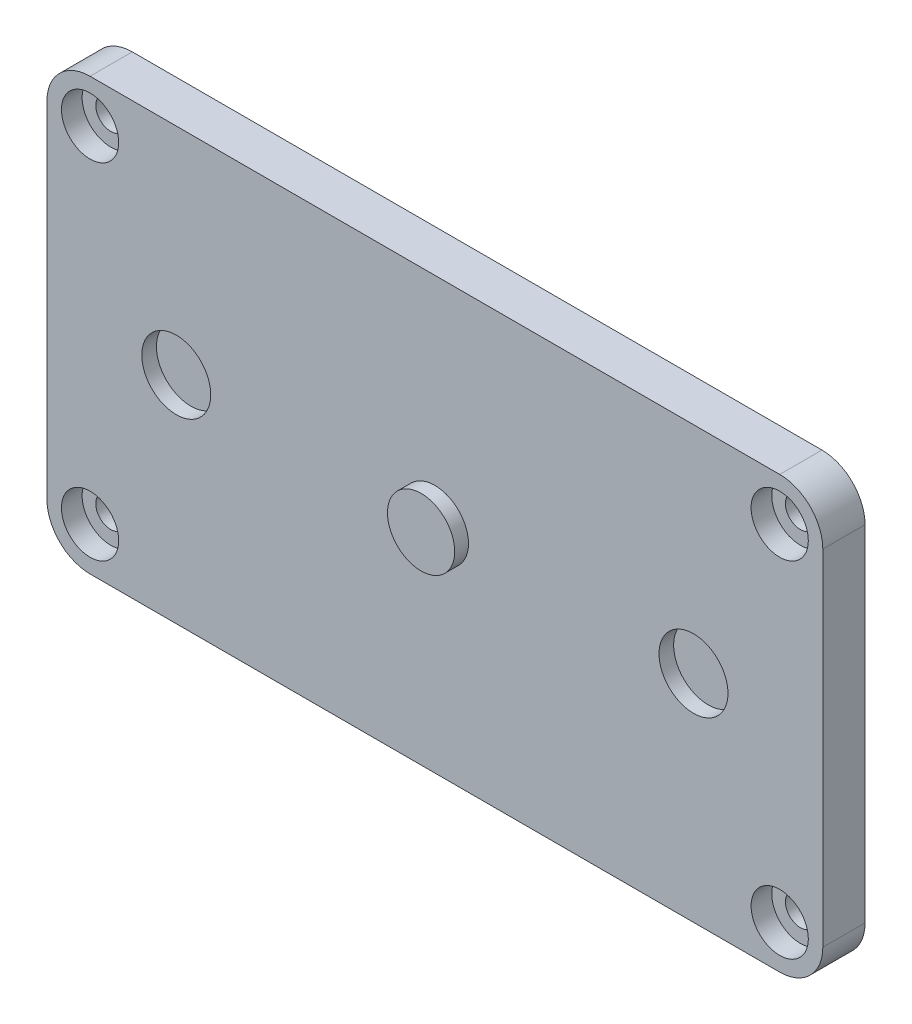
ISO-10303-21;
HEADER;
FILE_DESCRIPTION(('STEP AP214'),'2;1');
FILE_NAME('part.step','',(''),(''),'','','');
FILE_SCHEMA(('AUTOMOTIVE_DESIGN { 1 0 10303 214 1 1 1 1 }'));
ENDSEC;
DATA;
#1=APPLICATION_CONTEXT('core data for automotive mechanical design processes');
#2=APPLICATION_PROTOCOL_DEFINITION('international standard','automotive_design',2000,#1);
#3=PRODUCT_CONTEXT('',#1,'mechanical');
#4=PRODUCT('Part','Part','',(#3));
#5=PRODUCT_RELATED_PRODUCT_CATEGORY('part','',(#4));
#6=PRODUCT_DEFINITION_FORMATION('','',#4);
#7=PRODUCT_DEFINITION_CONTEXT('part definition',#1,'design');
#8=PRODUCT_DEFINITION('design','',#6,#7);
#9=PRODUCT_DEFINITION_SHAPE('','',#8);
#10=(LENGTH_UNIT() NAMED_UNIT(*) SI_UNIT(.MILLI.,.METRE.));
#11=(NAMED_UNIT(*) PLANE_ANGLE_UNIT() SI_UNIT($,.RADIAN.));
#12=(NAMED_UNIT(*) SI_UNIT($,.STERADIAN.) SOLID_ANGLE_UNIT());
#13=UNCERTAINTY_MEASURE_WITH_UNIT(LENGTH_MEASURE(1.E-05),#10,'distance_accuracy_value','');
#14=(GEOMETRIC_REPRESENTATION_CONTEXT(3) GLOBAL_UNCERTAINTY_ASSIGNED_CONTEXT((#13)) GLOBAL_UNIT_ASSIGNED_CONTEXT((#10,
#11,#12)) REPRESENTATION_CONTEXT('',''));
#15=CARTESIAN_POINT('',(0.,0.,0.));
#16=DIRECTION('',(0.,0.,1.));
#17=DIRECTION('',(1.,0.,0.));
#18=AXIS2_PLACEMENT_3D('',#15,#16,#17);
#19=CARTESIAN_POINT('',(-50.8,-25.4,6.223));
#20=DIRECTION('',(0.,0.,-1.));
#21=DIRECTION('',(-1.,0.,0.));
#22=AXIS2_PLACEMENT_3D('',#19,#20,#21);
#23=CYLINDRICAL_SURFACE('',#22,2.2098);
#24=CARTESIAN_POINT('',(-50.8,-25.4,0.));
#25=DIRECTION('',(0.,0.,1.));
#26=DIRECTION('',(1.,0.,0.));
#27=AXIS2_PLACEMENT_3D('',#24,#25,#26);
#28=CIRCLE('',#27,2.2098);
#29=CARTESIAN_POINT('',(-48.5902,-25.4,0.));
#30=VERTEX_POINT('',#29);
#31=EDGE_CURVE('E143',#30,#30,#28,.T.);
#32=ORIENTED_EDGE('',*,*,#31,.F.);
#33=EDGE_LOOP('',(#32));
#34=FACE_BOUND('',#33,.T.);
#35=CARTESIAN_POINT('',(-50.8,-25.4,3.175));
#36=DIRECTION('',(0.,0.,1.));
#37=DIRECTION('',(1.,0.,0.));
#38=AXIS2_PLACEMENT_3D('',#35,#36,#37);
#39=CIRCLE('',#38,2.2098);
#40=CARTESIAN_POINT('',(-48.5902,-25.4,3.175));
#41=VERTEX_POINT('',#40);
#42=EDGE_CURVE('E44',#41,#41,#39,.T.);
#43=ORIENTED_EDGE('',*,*,#42,.T.);
#44=EDGE_LOOP('',(#43));
#45=FACE_BOUND('',#44,.T.);
#46=ADVANCED_FACE('F40',(#34,#45),#23,.F.);
#47=CARTESIAN_POINT('',(-50.8,25.4,6.223));
#48=DIRECTION('',(0.,0.,-1.));
#49=DIRECTION('',(-1.,0.,0.));
#50=AXIS2_PLACEMENT_3D('',#47,#48,#49);
#51=CYLINDRICAL_SURFACE('',#50,2.2098);
#52=CARTESIAN_POINT('',(-50.8,25.4,0.));
#53=DIRECTION('',(0.,0.,1.));
#54=DIRECTION('',(1.,0.,0.));
#55=AXIS2_PLACEMENT_3D('',#52,#53,#54);
#56=CIRCLE('',#55,2.2098);
#57=CARTESIAN_POINT('',(-48.5902,25.4,0.));
#58=VERTEX_POINT('',#57);
#59=EDGE_CURVE('E186',#58,#58,#56,.T.);
#60=ORIENTED_EDGE('',*,*,#59,.F.);
#61=EDGE_LOOP('',(#60));
#62=FACE_BOUND('',#61,.T.);
#63=CARTESIAN_POINT('',(-50.8,25.4,3.175));
#64=DIRECTION('',(0.,0.,1.));
#65=DIRECTION('',(1.,0.,0.));
#66=AXIS2_PLACEMENT_3D('',#63,#64,#65);
#67=CIRCLE('',#66,2.2098);
#68=CARTESIAN_POINT('',(-48.5902,25.4,3.175));
#69=VERTEX_POINT('',#68);
#70=EDGE_CURVE('E172',#69,#69,#67,.T.);
#71=ORIENTED_EDGE('',*,*,#70,.T.);
#72=EDGE_LOOP('',(#71));
#73=FACE_BOUND('',#72,.T.);
#74=ADVANCED_FACE('F233',(#62,#73),#51,.F.);
#75=CARTESIAN_POINT('',(50.8,25.4,6.223));
#76=DIRECTION('',(0.,0.,-1.));
#77=DIRECTION('',(-1.,0.,0.));
#78=AXIS2_PLACEMENT_3D('',#75,#76,#77);
#79=CYLINDRICAL_SURFACE('',#78,2.2098);
#80=CARTESIAN_POINT('',(50.8,25.4,0.));
#81=DIRECTION('',(0.,0.,1.));
#82=DIRECTION('',(1.,0.,0.));
#83=AXIS2_PLACEMENT_3D('',#80,#81,#82);
#84=CIRCLE('',#83,2.2098);
#85=CARTESIAN_POINT('',(53.0098,25.4,0.));
#86=VERTEX_POINT('',#85);
#87=EDGE_CURVE('E181',#86,#86,#84,.T.);
#88=ORIENTED_EDGE('',*,*,#87,.F.);
#89=EDGE_LOOP('',(#88));
#90=FACE_BOUND('',#89,.T.);
#91=CARTESIAN_POINT('',(50.8,25.4,3.175));
#92=DIRECTION('',(0.,0.,1.));
#93=DIRECTION('',(1.,0.,0.));
#94=AXIS2_PLACEMENT_3D('',#91,#92,#93);
#95=CIRCLE('',#94,2.2098);
#96=CARTESIAN_POINT('',(53.0098,25.4,3.175));
#97=VERTEX_POINT('',#96);
#98=EDGE_CURVE('E169',#97,#97,#95,.T.);
#99=ORIENTED_EDGE('',*,*,#98,.T.);
#100=EDGE_LOOP('',(#99));
#101=FACE_BOUND('',#100,.T.);
#102=ADVANCED_FACE('F239',(#90,#101),#79,.F.);
#103=CARTESIAN_POINT('',(50.8,-25.4,6.223));
#104=DIRECTION('',(0.,0.,-1.));
#105=DIRECTION('',(-1.,0.,0.));
#106=AXIS2_PLACEMENT_3D('',#103,#104,#105);
#107=CYLINDRICAL_SURFACE('',#106,2.2098);
#108=CARTESIAN_POINT('',(50.8,-25.4,0.));
#109=DIRECTION('',(0.,0.,1.));
#110=DIRECTION('',(1.,0.,0.));
#111=AXIS2_PLACEMENT_3D('',#108,#109,#110);
#112=CIRCLE('',#111,2.2098);
#113=CARTESIAN_POINT('',(53.0098,-25.4,0.));
#114=VERTEX_POINT('',#113);
#115=EDGE_CURVE('E177',#114,#114,#112,.T.);
#116=ORIENTED_EDGE('',*,*,#115,.F.);
#117=EDGE_LOOP('',(#116));
#118=FACE_BOUND('',#117,.T.);
#119=CARTESIAN_POINT('',(50.8,-25.4,3.175));
#120=DIRECTION('',(0.,0.,1.));
#121=DIRECTION('',(1.,0.,0.));
#122=AXIS2_PLACEMENT_3D('',#119,#120,#121);
#123=CIRCLE('',#122,2.2098);
#124=CARTESIAN_POINT('',(53.0098,-25.4,3.175));
#125=VERTEX_POINT('',#124);
#126=EDGE_CURVE('E166',#125,#125,#123,.T.);
#127=ORIENTED_EDGE('',*,*,#126,.T.);
#128=EDGE_LOOP('',(#127));
#129=FACE_BOUND('',#128,.T.);
#130=ADVANCED_FACE('F246',(#118,#129),#107,.F.);
#131=CARTESIAN_POINT('',(50.8,-25.4,6.223));
#132=DIRECTION('',(0.,0.,1.));
#133=DIRECTION('',(1.,0.,0.));
#134=AXIS2_PLACEMENT_3D('',#131,#132,#133);
#135=PLANE('',#134);
#136=CARTESIAN_POINT('',(0.,0.,6.223));
#137=DIRECTION('',(0.,0.,1.));
#138=DIRECTION('',(1.,0.,0.));
#139=AXIS2_PLACEMENT_3D('',#136,#137,#138);
#140=CIRCLE('',#139,4.953);
#141=CARTESIAN_POINT('',(4.953,0.,6.223));
#142=VERTEX_POINT('',#141);
#143=EDGE_CURVE('E484',#142,#142,#140,.T.);
#144=ORIENTED_EDGE('',*,*,#143,.F.);
#145=EDGE_LOOP('',(#144));
#146=FACE_BOUND('',#145,.T.);
#147=CARTESIAN_POINT('',(38.1,0.,6.223));
#148=DIRECTION('',(0.,0.,1.));
#149=DIRECTION('',(1.,0.,0.));
#150=AXIS2_PLACEMENT_3D('',#147,#148,#149);
#151=CIRCLE('',#150,5.08);
#152=CARTESIAN_POINT('',(43.18,0.,6.223));
#153=VERTEX_POINT('',#152);
#154=EDGE_CURVE('E496',#153,#153,#151,.T.);
#155=ORIENTED_EDGE('',*,*,#154,.F.);
#156=EDGE_LOOP('',(#155));
#157=FACE_BOUND('',#156,.T.);
#158=CARTESIAN_POINT('',(-38.1,0.,6.223));
#159=DIRECTION('',(0.,0.,1.));
#160=DIRECTION('',(1.,0.,0.));
#161=AXIS2_PLACEMENT_3D('',#158,#159,#160);
#162=CIRCLE('',#161,5.08);
#163=CARTESIAN_POINT('',(-33.02,0.,6.223));
#164=VERTEX_POINT('',#163);
#165=EDGE_CURVE('E487',#164,#164,#162,.T.);
#166=ORIENTED_EDGE('',*,*,#165,.F.);
#167=EDGE_LOOP('',(#166));
#168=FACE_BOUND('',#167,.T.);
#169=CARTESIAN_POINT('',(-50.8,-25.4,6.223));
#170=DIRECTION('',(0.,0.,1.));
#171=DIRECTION('',(1.,0.,0.));
#172=AXIS2_PLACEMENT_3D('',#169,#170,#171);
#173=CIRCLE('',#172,4.2164);
#174=CARTESIAN_POINT('',(-46.5836,-25.4,6.223));
#175=VERTEX_POINT('',#174);
#176=EDGE_CURVE('E513',#175,#175,#173,.T.);
#177=ORIENTED_EDGE('',*,*,#176,.F.);
#178=EDGE_LOOP('',(#177));
#179=FACE_BOUND('',#178,.T.);
#180=CARTESIAN_POINT('',(50.8,-25.4,6.223));
#181=DIRECTION('',(0.,0.,1.));
#182=DIRECTION('',(1.,0.,0.));
#183=AXIS2_PLACEMENT_3D('',#180,#181,#182);
#184=CIRCLE('',#183,4.2164);
#185=CARTESIAN_POINT('',(55.0164,-25.4,6.223));
#186=VERTEX_POINT('',#185);
#187=EDGE_CURVE('E507',#186,#186,#184,.T.);
#188=ORIENTED_EDGE('',*,*,#187,.F.);
#189=EDGE_LOOP('',(#188));
#190=FACE_BOUND('',#189,.T.);
#191=CARTESIAN_POINT('',(50.8,25.4,6.223));
#192=DIRECTION('',(0.,0.,1.));
#193=DIRECTION('',(1.,0.,0.));
#194=AXIS2_PLACEMENT_3D('',#191,#192,#193);
#195=CIRCLE('',#194,4.2164);
#196=CARTESIAN_POINT('',(55.0164,25.4,6.223));
#197=VERTEX_POINT('',#196);
#198=EDGE_CURVE('E501',#197,#197,#195,.T.);
#199=ORIENTED_EDGE('',*,*,#198,.F.);
#200=EDGE_LOOP('',(#199));
#201=FACE_BOUND('',#200,.T.);
#202=CARTESIAN_POINT('',(-50.8,25.4,6.223));
#203=DIRECTION('',(0.,0.,1.));
#204=DIRECTION('',(1.,0.,0.));
#205=AXIS2_PLACEMENT_3D('',#202,#203,#204);
#206=CIRCLE('',#205,4.2164);
#207=CARTESIAN_POINT('',(-46.5836,25.4,6.223));
#208=VERTEX_POINT('',#207);
#209=EDGE_CURVE('E189',#208,#208,#206,.T.);
#210=ORIENTED_EDGE('',*,*,#209,.F.);
#211=EDGE_LOOP('',(#210));
#212=FACE_BOUND('',#211,.T.);
#213=CARTESIAN_POINT('',(50.8,-25.4,6.223));
#214=DIRECTION('',(0.,0.,1.));
#215=DIRECTION('',(1.,0.,0.));
#216=AXIS2_PLACEMENT_3D('',#213,#214,#215);
#217=CIRCLE('',#216,6.34999999999999);
#218=CARTESIAN_POINT('',(50.8,-31.75,6.223));
#219=VERTEX_POINT('',#218);
#220=CARTESIAN_POINT('',(57.15,-25.4,6.223));
#221=VERTEX_POINT('',#220);
#222=EDGE_CURVE('E154',#219,#221,#217,.T.);
#223=ORIENTED_EDGE('',*,*,#222,.T.);
#224=DIRECTION('',(0.,1.,0.));
#225=VECTOR('',#224,1.);
#226=CARTESIAN_POINT('',(57.15,-25.4,6.223));
#227=LINE('',#226,#225);
#228=CARTESIAN_POINT('',(57.15,25.4,6.223));
#229=VERTEX_POINT('',#228);
#230=EDGE_CURVE('E102',#221,#229,#227,.T.);
#231=ORIENTED_EDGE('',*,*,#230,.T.);
#232=CARTESIAN_POINT('',(50.8,25.4,6.223));
#233=DIRECTION('',(0.,0.,1.));
#234=DIRECTION('',(-1.,0.,0.));
#235=AXIS2_PLACEMENT_3D('',#232,#233,#234);
#236=CIRCLE('',#235,6.35);
#237=CARTESIAN_POINT('',(50.8,31.75,6.223));
#238=VERTEX_POINT('',#237);
#239=EDGE_CURVE('E198',#229,#238,#236,.T.);
#240=ORIENTED_EDGE('',*,*,#239,.T.);
#241=DIRECTION('',(-1.,0.,0.));
#242=VECTOR('',#241,1.);
#243=CARTESIAN_POINT('',(-50.8,31.75,6.223));
#244=LINE('',#243,#242);
#245=CARTESIAN_POINT('',(-50.8,31.75,6.223));
#246=VERTEX_POINT('',#245);
#247=EDGE_CURVE('E200',#238,#246,#244,.T.);
#248=ORIENTED_EDGE('',*,*,#247,.T.);
#249=CARTESIAN_POINT('',(-50.8,25.4,6.223));
#250=DIRECTION('',(0.,0.,1.));
#251=DIRECTION('',(-1.,0.,0.));
#252=AXIS2_PLACEMENT_3D('',#249,#250,#251);
#253=CIRCLE('',#252,6.35);
#254=CARTESIAN_POINT('',(-57.15,25.4,6.223));
#255=VERTEX_POINT('',#254);
#256=EDGE_CURVE('E121',#246,#255,#253,.T.);
#257=ORIENTED_EDGE('',*,*,#256,.T.);
#258=DIRECTION('',(0.,-1.,0.));
#259=VECTOR('',#258,1.);
#260=CARTESIAN_POINT('',(-57.15,-25.4,6.223));
#261=LINE('',#260,#259);
#262=CARTESIAN_POINT('',(-57.15,-25.4,6.223));
#263=VERTEX_POINT('',#262);
#264=EDGE_CURVE('E115',#255,#263,#261,.T.);
#265=ORIENTED_EDGE('',*,*,#264,.T.);
#266=CARTESIAN_POINT('',(-50.8,-25.4,6.223));
#267=DIRECTION('',(0.,0.,1.));
#268=DIRECTION('',(-1.,0.,0.));
#269=AXIS2_PLACEMENT_3D('',#266,#267,#268);
#270=CIRCLE('',#269,6.34999999999999);
#271=CARTESIAN_POINT('',(-50.8,-31.75,6.223));
#272=VERTEX_POINT('',#271);
#273=EDGE_CURVE('E119',#263,#272,#270,.T.);
#274=ORIENTED_EDGE('',*,*,#273,.T.);
#275=DIRECTION('',(1.,0.,0.));
#276=VECTOR('',#275,1.);
#277=CARTESIAN_POINT('',(-50.8,-31.75,6.223));
#278=LINE('',#277,#276);
#279=EDGE_CURVE('E59',#272,#219,#278,.T.);
#280=ORIENTED_EDGE('',*,*,#279,.T.);
#281=EDGE_LOOP('',(#223,#231,#240,#248,#257,#265,#274,#280));
#282=FACE_BOUND('',#281,.T.);
#283=ADVANCED_FACE('F117',(#146,#157,#168,#179,#190,#201,#212,#282),#135,.T.);
#284=CARTESIAN_POINT('',(50.8,-25.4,0.));
#285=DIRECTION('',(0.,0.,1.));
#286=DIRECTION('',(1.,0.,0.));
#287=AXIS2_PLACEMENT_3D('',#284,#285,#286);
#288=PLANE('',#287);
#289=CARTESIAN_POINT('',(50.8,-25.4,0.));
#290=DIRECTION('',(0.,0.,1.));
#291=DIRECTION('',(1.,0.,0.));
#292=AXIS2_PLACEMENT_3D('',#289,#290,#291);
#293=CIRCLE('',#292,6.34999999999999);
#294=CARTESIAN_POINT('',(50.8,-31.75,0.));
#295=VERTEX_POINT('',#294);
#296=CARTESIAN_POINT('',(57.15,-25.4,0.));
#297=VERTEX_POINT('',#296);
#298=EDGE_CURVE('E139',#295,#297,#293,.T.);
#299=ORIENTED_EDGE('',*,*,#298,.F.);
#300=DIRECTION('',(1.,0.,0.));
#301=VECTOR('',#300,1.);
#302=CARTESIAN_POINT('',(-50.8,-31.75,0.));
#303=LINE('',#302,#301);
#304=CARTESIAN_POINT('',(-50.8,-31.75,0.));
#305=VERTEX_POINT('',#304);
#306=EDGE_CURVE('E94',#305,#295,#303,.T.);
#307=ORIENTED_EDGE('',*,*,#306,.F.);
#308=CARTESIAN_POINT('',(-50.8,-25.4,0.));
#309=DIRECTION('',(0.,0.,1.));
#310=DIRECTION('',(-1.,0.,0.));
#311=AXIS2_PLACEMENT_3D('',#308,#309,#310);
#312=CIRCLE('',#311,6.34999999999999);
#313=CARTESIAN_POINT('',(-57.15,-25.4,0.));
#314=VERTEX_POINT('',#313);
#315=EDGE_CURVE('E88',#314,#305,#312,.T.);
#316=ORIENTED_EDGE('',*,*,#315,.F.);
#317=DIRECTION('',(0.,-1.,0.));
#318=VECTOR('',#317,1.);
#319=CARTESIAN_POINT('',(-57.15,-25.4,0.));
#320=LINE('',#319,#318);
#321=CARTESIAN_POINT('',(-57.15,25.4,0.));
#322=VERTEX_POINT('',#321);
#323=EDGE_CURVE('E129',#322,#314,#320,.T.);
#324=ORIENTED_EDGE('',*,*,#323,.F.);
#325=CARTESIAN_POINT('',(-50.8,25.4,0.));
#326=DIRECTION('',(0.,0.,1.));
#327=DIRECTION('',(-1.,0.,0.));
#328=AXIS2_PLACEMENT_3D('',#325,#326,#327);
#329=CIRCLE('',#328,6.35);
#330=CARTESIAN_POINT('',(-50.8,31.75,0.));
#331=VERTEX_POINT('',#330);
#332=EDGE_CURVE('E149',#331,#322,#329,.T.);
#333=ORIENTED_EDGE('',*,*,#332,.F.);
#334=DIRECTION('',(-1.,0.,0.));
#335=VECTOR('',#334,1.);
#336=CARTESIAN_POINT('',(-50.8,31.75,0.));
#337=LINE('',#336,#335);
#338=CARTESIAN_POINT('',(50.8,31.75,0.));
#339=VERTEX_POINT('',#338);
#340=EDGE_CURVE('E147',#339,#331,#337,.T.);
#341=ORIENTED_EDGE('',*,*,#340,.F.);
#342=CARTESIAN_POINT('',(50.8,25.4,0.));
#343=DIRECTION('',(0.,0.,1.));
#344=DIRECTION('',(-1.,0.,0.));
#345=AXIS2_PLACEMENT_3D('',#342,#343,#344);
#346=CIRCLE('',#345,6.35);
#347=CARTESIAN_POINT('',(57.15,25.4,0.));
#348=VERTEX_POINT('',#347);
#349=EDGE_CURVE('E145',#348,#339,#346,.T.);
#350=ORIENTED_EDGE('',*,*,#349,.F.);
#351=DIRECTION('',(0.,1.,0.));
#352=VECTOR('',#351,1.);
#353=CARTESIAN_POINT('',(57.15,-25.4,0.));
#354=LINE('',#353,#352);
#355=EDGE_CURVE('E142',#297,#348,#354,.T.);
#356=ORIENTED_EDGE('',*,*,#355,.F.);
#357=EDGE_LOOP('',(#299,#307,#316,#324,#333,#341,#350,#356));
#358=FACE_BOUND('',#357,.T.);
#359=ORIENTED_EDGE('',*,*,#31,.T.);
#360=EDGE_LOOP('',(#359));
#361=FACE_BOUND('',#360,.T.);
#362=ORIENTED_EDGE('',*,*,#59,.T.);
#363=EDGE_LOOP('',(#362));
#364=FACE_BOUND('',#363,.T.);
#365=ORIENTED_EDGE('',*,*,#87,.T.);
#366=EDGE_LOOP('',(#365));
#367=FACE_BOUND('',#366,.T.);
#368=ORIENTED_EDGE('',*,*,#115,.T.);
#369=EDGE_LOOP('',(#368));
#370=FACE_BOUND('',#369,.T.);
#371=ADVANCED_FACE('F213',(#358,#361,#364,#367,#370),#288,.F.);
#372=CARTESIAN_POINT('',(50.8,-25.4,6.223));
#373=DIRECTION('',(0.,0.,-1.));
#374=DIRECTION('',(-1.,0.,0.));
#375=AXIS2_PLACEMENT_3D('',#372,#373,#374);
#376=CYLINDRICAL_SURFACE('',#375,6.34999999999999);
#377=ORIENTED_EDGE('',*,*,#298,.T.);
#378=DIRECTION('',(0.,0.,-1.));
#379=VECTOR('',#378,1.);
#380=CARTESIAN_POINT('',(57.15,-25.4,6.223));
#381=LINE('',#380,#379);
#382=EDGE_CURVE('E11',#221,#297,#381,.T.);
#383=ORIENTED_EDGE('',*,*,#382,.F.);
#384=ORIENTED_EDGE('',*,*,#222,.F.);
#385=DIRECTION('',(0.,0.,-1.));
#386=VECTOR('',#385,1.);
#387=CARTESIAN_POINT('',(50.8,-31.75,6.223));
#388=LINE('',#387,#386);
#389=EDGE_CURVE('E135',#219,#295,#388,.T.);
#390=ORIENTED_EDGE('',*,*,#389,.T.);
#391=EDGE_LOOP('',(#377,#383,#384,#390));
#392=FACE_BOUND('',#391,.T.);
#393=ADVANCED_FACE('F42',(#392),#376,.T.);
#394=CARTESIAN_POINT('',(57.15,-25.4,6.223));
#395=DIRECTION('',(-1.,0.,0.));
#396=DIRECTION('',(0.,0.,1.));
#397=AXIS2_PLACEMENT_3D('',#394,#395,#396);
#398=PLANE('',#397);
#399=ORIENTED_EDGE('',*,*,#355,.T.);
#400=DIRECTION('',(0.,0.,-1.));
#401=VECTOR('',#400,1.);
#402=CARTESIAN_POINT('',(57.15,25.4,6.223));
#403=LINE('',#402,#401);
#404=EDGE_CURVE('E50',#229,#348,#403,.T.);
#405=ORIENTED_EDGE('',*,*,#404,.F.);
#406=ORIENTED_EDGE('',*,*,#230,.F.);
#407=ORIENTED_EDGE('',*,*,#382,.T.);
#408=EDGE_LOOP('',(#399,#405,#406,#407));
#409=FACE_BOUND('',#408,.T.);
#410=ADVANCED_FACE('F253',(#409),#398,.F.);
#411=CARTESIAN_POINT('',(50.8,25.4,6.223));
#412=DIRECTION('',(0.,0.,-1.));
#413=DIRECTION('',(-1.,0.,0.));
#414=AXIS2_PLACEMENT_3D('',#411,#412,#413);
#415=CYLINDRICAL_SURFACE('',#414,6.35);
#416=ORIENTED_EDGE('',*,*,#349,.T.);
#417=DIRECTION('',(0.,0.,-1.));
#418=VECTOR('',#417,1.);
#419=CARTESIAN_POINT('',(50.8,31.75,6.223));
#420=LINE('',#419,#418);
#421=EDGE_CURVE('E161',#238,#339,#420,.T.);
#422=ORIENTED_EDGE('',*,*,#421,.F.);
#423=ORIENTED_EDGE('',*,*,#239,.F.);
#424=ORIENTED_EDGE('',*,*,#404,.T.);
#425=EDGE_LOOP('',(#416,#422,#423,#424));
#426=FACE_BOUND('',#425,.T.);
#427=ADVANCED_FACE('F257',(#426),#415,.T.);
#428=CARTESIAN_POINT('',(-50.8,31.75,6.223));
#429=DIRECTION('',(0.,-1.,0.));
#430=DIRECTION('',(0.,0.,-1.));
#431=AXIS2_PLACEMENT_3D('',#428,#429,#430);
#432=PLANE('',#431);
#433=ORIENTED_EDGE('',*,*,#340,.T.);
#434=DIRECTION('',(0.,0.,-1.));
#435=VECTOR('',#434,1.);
#436=CARTESIAN_POINT('',(-50.8,31.75,6.223));
#437=LINE('',#436,#435);
#438=EDGE_CURVE('E158',#246,#331,#437,.T.);
#439=ORIENTED_EDGE('',*,*,#438,.F.);
#440=ORIENTED_EDGE('',*,*,#247,.F.);
#441=ORIENTED_EDGE('',*,*,#421,.T.);
#442=EDGE_LOOP('',(#433,#439,#440,#441));
#443=FACE_BOUND('',#442,.T.);
#444=ADVANCED_FACE('F206',(#443),#432,.F.);
#445=CARTESIAN_POINT('',(-50.8,25.4,6.223));
#446=DIRECTION('',(0.,0.,-1.));
#447=DIRECTION('',(-1.,0.,0.));
#448=AXIS2_PLACEMENT_3D('',#445,#446,#447);
#449=CYLINDRICAL_SURFACE('',#448,6.35);
#450=ORIENTED_EDGE('',*,*,#332,.T.);
#451=DIRECTION('',(0.,0.,-1.));
#452=VECTOR('',#451,1.);
#453=CARTESIAN_POINT('',(-57.15,25.4,6.223));
#454=LINE('',#453,#452);
#455=EDGE_CURVE('E130',#255,#322,#454,.T.);
#456=ORIENTED_EDGE('',*,*,#455,.F.);
#457=ORIENTED_EDGE('',*,*,#256,.F.);
#458=ORIENTED_EDGE('',*,*,#438,.T.);
#459=EDGE_LOOP('',(#450,#456,#457,#458));
#460=FACE_BOUND('',#459,.T.);
#461=ADVANCED_FACE('F210',(#460),#449,.T.);
#462=CARTESIAN_POINT('',(-57.15,-25.4,6.223));
#463=DIRECTION('',(1.,0.,0.));
#464=DIRECTION('',(0.,0.,-1.));
#465=AXIS2_PLACEMENT_3D('',#462,#463,#464);
#466=PLANE('',#465);
#467=ORIENTED_EDGE('',*,*,#323,.T.);
#468=DIRECTION('',(0.,0.,-1.));
#469=VECTOR('',#468,1.);
#470=CARTESIAN_POINT('',(-57.15,-25.4,6.223));
#471=LINE('',#470,#469);
#472=EDGE_CURVE('E126',#263,#314,#471,.T.);
#473=ORIENTED_EDGE('',*,*,#472,.F.);
#474=ORIENTED_EDGE('',*,*,#264,.F.);
#475=ORIENTED_EDGE('',*,*,#455,.T.);
#476=EDGE_LOOP('',(#467,#473,#474,#475));
#477=FACE_BOUND('',#476,.T.);
#478=ADVANCED_FACE('F127',(#477),#466,.F.);
#479=CARTESIAN_POINT('',(-50.8,-25.4,6.223));
#480=DIRECTION('',(0.,0.,-1.));
#481=DIRECTION('',(-1.,0.,0.));
#482=AXIS2_PLACEMENT_3D('',#479,#480,#481);
#483=CYLINDRICAL_SURFACE('',#482,6.34999999999999);
#484=ORIENTED_EDGE('',*,*,#315,.T.);
#485=DIRECTION('',(0.,0.,-1.));
#486=VECTOR('',#485,1.);
#487=CARTESIAN_POINT('',(-50.8,-31.75,6.223));
#488=LINE('',#487,#486);
#489=EDGE_CURVE('E131',#272,#305,#488,.T.);
#490=ORIENTED_EDGE('',*,*,#489,.F.);
#491=ORIENTED_EDGE('',*,*,#273,.F.);
#492=ORIENTED_EDGE('',*,*,#472,.T.);
#493=EDGE_LOOP('',(#484,#490,#491,#492));
#494=FACE_BOUND('',#493,.T.);
#495=ADVANCED_FACE('F133',(#494),#483,.T.);
#496=CARTESIAN_POINT('',(-50.8,-31.75,6.223));
#497=DIRECTION('',(0.,1.,0.));
#498=DIRECTION('',(0.,0.,1.));
#499=AXIS2_PLACEMENT_3D('',#496,#497,#498);
#500=PLANE('',#499);
#501=ORIENTED_EDGE('',*,*,#306,.T.);
#502=ORIENTED_EDGE('',*,*,#389,.F.);
#503=ORIENTED_EDGE('',*,*,#279,.F.);
#504=ORIENTED_EDGE('',*,*,#489,.T.);
#505=EDGE_LOOP('',(#501,#502,#503,#504));
#506=FACE_BOUND('',#505,.T.);
#507=ADVANCED_FACE('F219',(#506),#500,.F.);
#508=CARTESIAN_POINT('',(50.8,-25.4,3.175));
#509=DIRECTION('',(0.,0.,1.));
#510=DIRECTION('',(1.,0.,0.));
#511=AXIS2_PLACEMENT_3D('',#508,#509,#510);
#512=CYLINDRICAL_SURFACE('',#511,4.2164);
#513=CARTESIAN_POINT('',(50.8,-25.4,3.175));
#514=DIRECTION('',(0.,0.,1.));
#515=DIRECTION('',(1.,0.,0.));
#516=AXIS2_PLACEMENT_3D('',#513,#514,#515);
#517=CIRCLE('',#516,4.2164);
#518=CARTESIAN_POINT('',(55.0164,-25.4,3.175));
#519=VERTEX_POINT('',#518);
#520=EDGE_CURVE('E510',#519,#519,#517,.T.);
#521=ORIENTED_EDGE('',*,*,#520,.F.);
#522=EDGE_LOOP('',(#521));
#523=FACE_BOUND('',#522,.T.);
#524=ORIENTED_EDGE('',*,*,#187,.T.);
#525=EDGE_LOOP('',(#524));
#526=FACE_BOUND('',#525,.T.);
#527=ADVANCED_FACE('F221',(#523,#526),#512,.F.);
#528=CARTESIAN_POINT('',(50.8,-25.4,3.175));
#529=DIRECTION('',(0.,0.,1.));
#530=DIRECTION('',(1.,0.,0.));
#531=AXIS2_PLACEMENT_3D('',#528,#529,#530);
#532=PLANE('',#531);
#533=ORIENTED_EDGE('',*,*,#126,.F.);
#534=EDGE_LOOP('',(#533));
#535=FACE_BOUND('',#534,.T.);
#536=ORIENTED_EDGE('',*,*,#520,.T.);
#537=EDGE_LOOP('',(#536));
#538=FACE_BOUND('',#537,.T.);
#539=ADVANCED_FACE('F227',(#535,#538),#532,.T.);
#540=CARTESIAN_POINT('',(50.8,25.4,3.175));
#541=DIRECTION('',(0.,0.,1.));
#542=DIRECTION('',(1.,0.,0.));
#543=AXIS2_PLACEMENT_3D('',#540,#541,#542);
#544=CYLINDRICAL_SURFACE('',#543,4.2164);
#545=CARTESIAN_POINT('',(50.8,25.4,3.175));
#546=DIRECTION('',(0.,0.,1.));
#547=DIRECTION('',(1.,0.,0.));
#548=AXIS2_PLACEMENT_3D('',#545,#546,#547);
#549=CIRCLE('',#548,4.2164);
#550=CARTESIAN_POINT('',(55.0164,25.4,3.175));
#551=VERTEX_POINT('',#550);
#552=EDGE_CURVE('E504',#551,#551,#549,.T.);
#553=ORIENTED_EDGE('',*,*,#552,.F.);
#554=EDGE_LOOP('',(#553));
#555=FACE_BOUND('',#554,.T.);
#556=ORIENTED_EDGE('',*,*,#198,.T.);
#557=EDGE_LOOP('',(#556));
#558=FACE_BOUND('',#557,.T.);
#559=ADVANCED_FACE('F326',(#555,#558),#544,.F.);
#560=CARTESIAN_POINT('',(50.8,25.4,3.175));
#561=DIRECTION('',(0.,0.,1.));
#562=DIRECTION('',(1.,0.,0.));
#563=AXIS2_PLACEMENT_3D('',#560,#561,#562);
#564=PLANE('',#563);
#565=ORIENTED_EDGE('',*,*,#98,.F.);
#566=EDGE_LOOP('',(#565));
#567=FACE_BOUND('',#566,.T.);
#568=ORIENTED_EDGE('',*,*,#552,.T.);
#569=EDGE_LOOP('',(#568));
#570=FACE_BOUND('',#569,.T.);
#571=ADVANCED_FACE('F337',(#567,#570),#564,.T.);
#572=CARTESIAN_POINT('',(-50.8,25.4,3.175));
#573=DIRECTION('',(0.,0.,1.));
#574=DIRECTION('',(1.,0.,0.));
#575=AXIS2_PLACEMENT_3D('',#572,#573,#574);
#576=CYLINDRICAL_SURFACE('',#575,4.2164);
#577=CARTESIAN_POINT('',(-50.8,25.4,3.175));
#578=DIRECTION('',(0.,0.,1.));
#579=DIRECTION('',(1.,0.,0.));
#580=AXIS2_PLACEMENT_3D('',#577,#578,#579);
#581=CIRCLE('',#580,4.2164);
#582=CARTESIAN_POINT('',(-46.5836,25.4,3.175));
#583=VERTEX_POINT('',#582);
#584=EDGE_CURVE('E170',#583,#583,#581,.T.);
#585=ORIENTED_EDGE('',*,*,#584,.F.);
#586=EDGE_LOOP('',(#585));
#587=FACE_BOUND('',#586,.T.);
#588=ORIENTED_EDGE('',*,*,#209,.T.);
#589=EDGE_LOOP('',(#588));
#590=FACE_BOUND('',#589,.T.);
#591=ADVANCED_FACE('F348',(#587,#590),#576,.F.);
#592=CARTESIAN_POINT('',(-50.8,25.4,3.175));
#593=DIRECTION('',(0.,0.,1.));
#594=DIRECTION('',(1.,0.,0.));
#595=AXIS2_PLACEMENT_3D('',#592,#593,#594);
#596=PLANE('',#595);
#597=ORIENTED_EDGE('',*,*,#70,.F.);
#598=EDGE_LOOP('',(#597));
#599=FACE_BOUND('',#598,.T.);
#600=ORIENTED_EDGE('',*,*,#584,.T.);
#601=EDGE_LOOP('',(#600));
#602=FACE_BOUND('',#601,.T.);
#603=ADVANCED_FACE('F359',(#599,#602),#596,.T.);
#604=CARTESIAN_POINT('',(-50.8,-25.4,3.175));
#605=DIRECTION('',(0.,0.,1.));
#606=DIRECTION('',(1.,0.,0.));
#607=AXIS2_PLACEMENT_3D('',#604,#605,#606);
#608=CYLINDRICAL_SURFACE('',#607,4.2164);
#609=CARTESIAN_POINT('',(-50.8,-25.4,3.175));
#610=DIRECTION('',(0.,0.,1.));
#611=DIRECTION('',(1.,0.,0.));
#612=AXIS2_PLACEMENT_3D('',#609,#610,#611);
#613=CIRCLE('',#612,4.2164);
#614=CARTESIAN_POINT('',(-46.5836,-25.4,3.175));
#615=VERTEX_POINT('',#614);
#616=EDGE_CURVE('E495',#615,#615,#613,.T.);
#617=ORIENTED_EDGE('',*,*,#616,.F.);
#618=EDGE_LOOP('',(#617));
#619=FACE_BOUND('',#618,.T.);
#620=ORIENTED_EDGE('',*,*,#176,.T.);
#621=EDGE_LOOP('',(#620));
#622=FACE_BOUND('',#621,.T.);
#623=ADVANCED_FACE('F370',(#619,#622),#608,.F.);
#624=CARTESIAN_POINT('',(-50.8,-25.4,3.175));
#625=DIRECTION('',(0.,0.,1.));
#626=DIRECTION('',(1.,0.,0.));
#627=AXIS2_PLACEMENT_3D('',#624,#625,#626);
#628=PLANE('',#627);
#629=ORIENTED_EDGE('',*,*,#42,.F.);
#630=EDGE_LOOP('',(#629));
#631=FACE_BOUND('',#630,.T.);
#632=ORIENTED_EDGE('',*,*,#616,.T.);
#633=EDGE_LOOP('',(#632));
#634=FACE_BOUND('',#633,.T.);
#635=ADVANCED_FACE('F381',(#631,#634),#628,.T.);
#636=CARTESIAN_POINT('',(-38.1,0.,4.064));
#637=DIRECTION('',(0.,0.,1.));
#638=DIRECTION('',(1.,0.,0.));
#639=AXIS2_PLACEMENT_3D('',#636,#637,#638);
#640=CYLINDRICAL_SURFACE('',#639,5.08);
#641=CARTESIAN_POINT('',(-38.1,0.,4.064));
#642=DIRECTION('',(0.,0.,1.));
#643=DIRECTION('',(1.,0.,0.));
#644=AXIS2_PLACEMENT_3D('',#641,#642,#643);
#645=CIRCLE('',#644,5.08);
#646=CARTESIAN_POINT('',(-33.02,0.,4.064));
#647=VERTEX_POINT('',#646);
#648=EDGE_CURVE('E483',#647,#647,#645,.T.);
#649=ORIENTED_EDGE('',*,*,#648,.F.);
#650=EDGE_LOOP('',(#649));
#651=FACE_BOUND('',#650,.T.);
#652=ORIENTED_EDGE('',*,*,#165,.T.);
#653=EDGE_LOOP('',(#652));
#654=FACE_BOUND('',#653,.T.);
#655=ADVANCED_FACE('F392',(#651,#654),#640,.F.);
#656=CARTESIAN_POINT('',(-38.1,0.,4.064));
#657=DIRECTION('',(0.,0.,1.));
#658=DIRECTION('',(1.,0.,0.));
#659=AXIS2_PLACEMENT_3D('',#656,#657,#658);
#660=PLANE('',#659);
#661=ORIENTED_EDGE('',*,*,#648,.T.);
#662=EDGE_LOOP('',(#661));
#663=FACE_BOUND('',#662,.T.);
#664=ADVANCED_FACE('F403',(#663),#660,.T.);
#665=CARTESIAN_POINT('',(38.1,0.,4.064));
#666=DIRECTION('',(0.,0.,1.));
#667=DIRECTION('',(1.,0.,0.));
#668=AXIS2_PLACEMENT_3D('',#665,#666,#667);
#669=CYLINDRICAL_SURFACE('',#668,5.08);
#670=CARTESIAN_POINT('',(38.1,0.,4.064));
#671=DIRECTION('',(0.,0.,1.));
#672=DIRECTION('',(1.,0.,0.));
#673=AXIS2_PLACEMENT_3D('',#670,#671,#672);
#674=CIRCLE('',#673,5.08);
#675=CARTESIAN_POINT('',(43.18,0.,4.064));
#676=VERTEX_POINT('',#675);
#677=EDGE_CURVE('E492',#676,#676,#674,.T.);
#678=ORIENTED_EDGE('',*,*,#677,.F.);
#679=EDGE_LOOP('',(#678));
#680=FACE_BOUND('',#679,.T.);
#681=ORIENTED_EDGE('',*,*,#154,.T.);
#682=EDGE_LOOP('',(#681));
#683=FACE_BOUND('',#682,.T.);
#684=ADVANCED_FACE('F414',(#680,#683),#669,.F.);
#685=CARTESIAN_POINT('',(38.1,0.,4.064));
#686=DIRECTION('',(0.,0.,1.));
#687=DIRECTION('',(1.,0.,0.));
#688=AXIS2_PLACEMENT_3D('',#685,#686,#687);
#689=PLANE('',#688);
#690=ORIENTED_EDGE('',*,*,#677,.T.);
#691=EDGE_LOOP('',(#690));
#692=FACE_BOUND('',#691,.T.);
#693=ADVANCED_FACE('F425',(#692),#689,.T.);
#694=CARTESIAN_POINT('',(0.,0.,8.255));
#695=DIRECTION('',(0.,0.,-1.));
#696=DIRECTION('',(-1.,0.,0.));
#697=AXIS2_PLACEMENT_3D('',#694,#695,#696);
#698=CYLINDRICAL_SURFACE('',#697,4.953);
#699=CARTESIAN_POINT('',(0.,0.,8.255));
#700=DIRECTION('',(0.,0.,1.));
#701=DIRECTION('',(1.,0.,0.));
#702=AXIS2_PLACEMENT_3D('',#699,#700,#701);
#703=CIRCLE('',#702,4.953);
#704=CARTESIAN_POINT('',(4.953,0.,8.255));
#705=VERTEX_POINT('',#704);
#706=EDGE_CURVE('E482',#705,#705,#703,.T.);
#707=ORIENTED_EDGE('',*,*,#706,.F.);
#708=EDGE_LOOP('',(#707));
#709=FACE_BOUND('',#708,.T.);
#710=ORIENTED_EDGE('',*,*,#143,.T.);
#711=EDGE_LOOP('',(#710));
#712=FACE_BOUND('',#711,.T.);
#713=ADVANCED_FACE('F435',(#709,#712),#698,.T.);
#714=CARTESIAN_POINT('',(0.,0.,8.255));
#715=DIRECTION('',(0.,0.,1.));
#716=DIRECTION('',(1.,0.,0.));
#717=AXIS2_PLACEMENT_3D('',#714,#715,#716);
#718=PLANE('',#717);
#719=ORIENTED_EDGE('',*,*,#706,.T.);
#720=EDGE_LOOP('',(#719));
#721=FACE_BOUND('',#720,.T.);
#722=ADVANCED_FACE('F450',(#721),#718,.T.);
#723=CLOSED_SHELL('',(#46,#74,#102,#130,#283,#371,#393,#410,#427,#444,#461,#478,#495,#507,#527,
#539,#559,#571,#591,#603,#623,#635,#655,#664,#684,#693,#713,#722));
#724=MANIFOLD_SOLID_BREP('B2',#723);
#725=ADVANCED_BREP_SHAPE_REPRESENTATION('',(#18,#724),#14);
#726=SHAPE_DEFINITION_REPRESENTATION(#9,#725);
ENDSEC;
END-ISO-10303-21;
